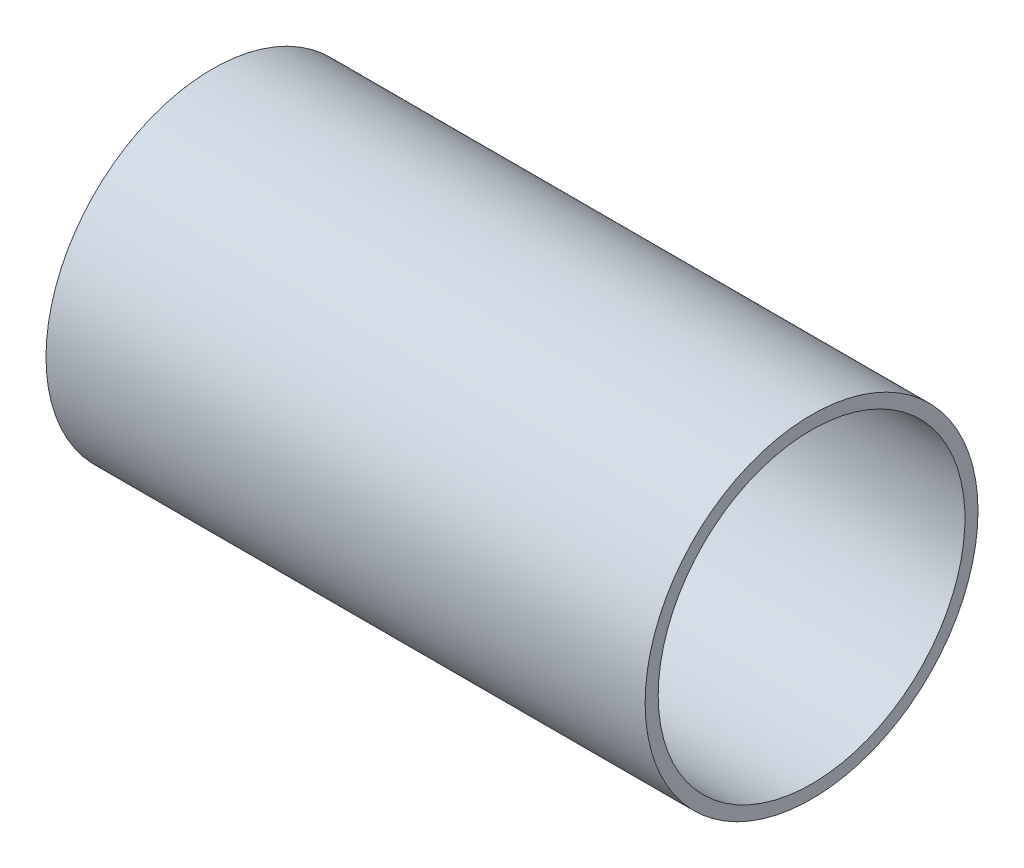
ISO-10303-21;
HEADER;
FILE_DESCRIPTION(('STEP AP214'),'2;1');
FILE_NAME('part.step','',(''),(''),'','','');
FILE_SCHEMA(('AUTOMOTIVE_DESIGN { 1 0 10303 214 1 1 1 1 }'));
ENDSEC;
DATA;
#1=APPLICATION_CONTEXT('core data for automotive mechanical design processes');
#2=APPLICATION_PROTOCOL_DEFINITION('international standard','automotive_design',2000,#1);
#3=PRODUCT_CONTEXT('',#1,'mechanical');
#4=PRODUCT('Part','Part','',(#3));
#5=PRODUCT_RELATED_PRODUCT_CATEGORY('part','',(#4));
#6=PRODUCT_DEFINITION_FORMATION('','',#4);
#7=PRODUCT_DEFINITION_CONTEXT('part definition',#1,'design');
#8=PRODUCT_DEFINITION('design','',#6,#7);
#9=PRODUCT_DEFINITION_SHAPE('','',#8);
#10=(LENGTH_UNIT() NAMED_UNIT(*) SI_UNIT(.MILLI.,.METRE.));
#11=(NAMED_UNIT(*) PLANE_ANGLE_UNIT() SI_UNIT($,.RADIAN.));
#12=(NAMED_UNIT(*) SI_UNIT($,.STERADIAN.) SOLID_ANGLE_UNIT());
#13=UNCERTAINTY_MEASURE_WITH_UNIT(LENGTH_MEASURE(1.E-05),#10,'distance_accuracy_value','');
#14=(GEOMETRIC_REPRESENTATION_CONTEXT(3) GLOBAL_UNCERTAINTY_ASSIGNED_CONTEXT((#13)) GLOBAL_UNIT_ASSIGNED_CONTEXT((#10,
#11,#12)) REPRESENTATION_CONTEXT('',''));
#15=CARTESIAN_POINT('',(0.,0.,0.));
#16=DIRECTION('',(0.,0.,1.));
#17=DIRECTION('',(1.,0.,0.));
#18=AXIS2_PLACEMENT_3D('',#15,#16,#17);
#19=CARTESIAN_POINT('',(-72.8939918967907,0.,0.));
#20=DIRECTION('',(-1.,0.,0.));
#21=DIRECTION('',(0.,0.,1.));
#22=AXIS2_PLACEMENT_3D('',#19,#20,#21);
#23=CYLINDRICAL_SURFACE('',#22,15.875);
#24=CARTESIAN_POINT('',(-28.575,0.,0.));
#25=DIRECTION('',(-1.,0.,0.));
#26=DIRECTION('',(0.,0.,1.));
#27=AXIS2_PLACEMENT_3D('',#24,#25,#26);
#28=CIRCLE('',#27,15.875);
#29=CARTESIAN_POINT('',(-28.575,0.,15.875));
#30=VERTEX_POINT('',#29);
#31=EDGE_CURVE('E46',#30,#30,#28,.T.);
#32=ORIENTED_EDGE('',*,*,#31,.F.);
#33=EDGE_LOOP('',(#32));
#34=FACE_BOUND('',#33,.T.);
#35=CARTESIAN_POINT('',(28.575,0.,0.));
#36=DIRECTION('',(-1.,0.,0.));
#37=DIRECTION('',(0.,0.,1.));
#38=AXIS2_PLACEMENT_3D('',#35,#36,#37);
#39=CIRCLE('',#38,15.875);
#40=CARTESIAN_POINT('',(28.575,0.,15.875));
#41=VERTEX_POINT('',#40);
#42=EDGE_CURVE('E10',#41,#41,#39,.T.);
#43=ORIENTED_EDGE('',*,*,#42,.T.);
#44=EDGE_LOOP('',(#43));
#45=FACE_BOUND('',#44,.T.);
#46=ADVANCED_FACE('F32',(#34,#45),#23,.T.);
#47=CARTESIAN_POINT('',(28.575,0.,-15.875));
#48=DIRECTION('',(-1.,0.,0.));
#49=DIRECTION('',(0.,0.,1.));
#50=AXIS2_PLACEMENT_3D('',#47,#48,#49);
#51=PLANE('',#50);
#52=ORIENTED_EDGE('',*,*,#42,.F.);
#53=EDGE_LOOP('',(#52));
#54=FACE_BOUND('',#53,.T.);
#55=CARTESIAN_POINT('',(28.575,0.,0.));
#56=DIRECTION('',(-1.,0.,0.));
#57=DIRECTION('',(0.,0.,1.));
#58=AXIS2_PLACEMENT_3D('',#55,#56,#57);
#59=CIRCLE('',#58,14.6304);
#60=CARTESIAN_POINT('',(28.575,0.,14.6304));
#61=VERTEX_POINT('',#60);
#62=EDGE_CURVE('E38',#61,#61,#59,.T.);
#63=ORIENTED_EDGE('',*,*,#62,.T.);
#64=EDGE_LOOP('',(#63));
#65=FACE_BOUND('',#64,.T.);
#66=ADVANCED_FACE('F55',(#54,#65),#51,.F.);
#67=CARTESIAN_POINT('',(-72.8939918967907,0.,0.));
#68=DIRECTION('',(-1.,0.,0.));
#69=DIRECTION('',(0.,0.,1.));
#70=AXIS2_PLACEMENT_3D('',#67,#68,#69);
#71=CYLINDRICAL_SURFACE('',#70,14.6304);
#72=ORIENTED_EDGE('',*,*,#62,.F.);
#73=EDGE_LOOP('',(#72));
#74=FACE_BOUND('',#73,.T.);
#75=CARTESIAN_POINT('',(-28.575,0.,0.));
#76=DIRECTION('',(-1.,0.,0.));
#77=DIRECTION('',(0.,0.,1.));
#78=AXIS2_PLACEMENT_3D('',#75,#76,#77);
#79=CIRCLE('',#78,14.6304);
#80=CARTESIAN_POINT('',(-28.575,0.,14.6304));
#81=VERTEX_POINT('',#80);
#82=EDGE_CURVE('E42',#81,#81,#79,.T.);
#83=ORIENTED_EDGE('',*,*,#82,.T.);
#84=EDGE_LOOP('',(#83));
#85=FACE_BOUND('',#84,.T.);
#86=ADVANCED_FACE('F59',(#74,#85),#71,.F.);
#87=CARTESIAN_POINT('',(-28.575,0.,-15.875));
#88=DIRECTION('',(1.,0.,0.));
#89=DIRECTION('',(0.,0.,-1.));
#90=AXIS2_PLACEMENT_3D('',#87,#88,#89);
#91=PLANE('',#90);
#92=ORIENTED_EDGE('',*,*,#82,.F.);
#93=EDGE_LOOP('',(#92));
#94=FACE_BOUND('',#93,.T.);
#95=ORIENTED_EDGE('',*,*,#31,.T.);
#96=EDGE_LOOP('',(#95));
#97=FACE_BOUND('',#96,.T.);
#98=ADVANCED_FACE('F52',(#94,#97),#91,.F.);
#99=CLOSED_SHELL('',(#46,#66,#86,#98));
#100=MANIFOLD_SOLID_BREP('B2',#99);
#101=ADVANCED_BREP_SHAPE_REPRESENTATION('',(#18,#100),#14);
#102=SHAPE_DEFINITION_REPRESENTATION(#9,#101);
ENDSEC;
END-ISO-10303-21;
